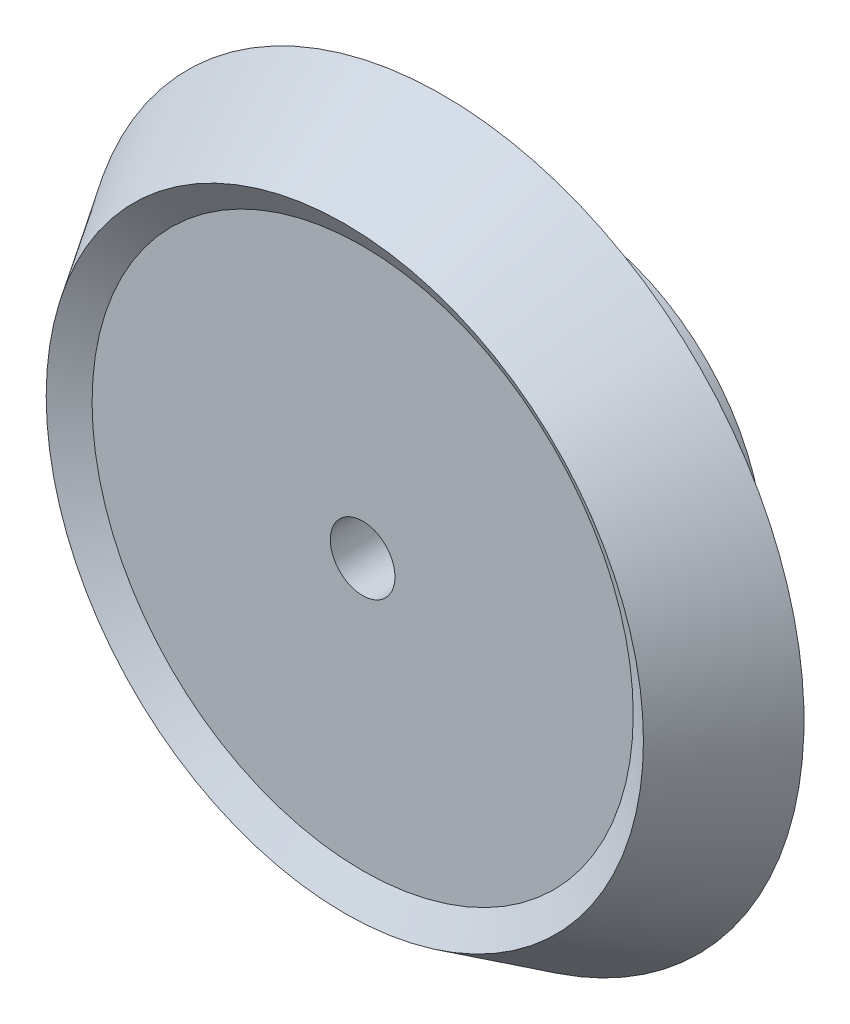
ISO-10303-21;
HEADER;
FILE_DESCRIPTION(('STEP AP214'),'2;1');
FILE_NAME('part.step','',(''),(''),'','','');
FILE_SCHEMA(('AUTOMOTIVE_DESIGN { 1 0 10303 214 1 1 1 1 }'));
ENDSEC;
DATA;
#1=APPLICATION_CONTEXT('core data for automotive mechanical design processes');
#2=APPLICATION_PROTOCOL_DEFINITION('international standard','automotive_design',2000,#1);
#3=PRODUCT_CONTEXT('',#1,'mechanical');
#4=PRODUCT('Part','Part','',(#3));
#5=PRODUCT_RELATED_PRODUCT_CATEGORY('part','',(#4));
#6=PRODUCT_DEFINITION_FORMATION('','',#4);
#7=PRODUCT_DEFINITION_CONTEXT('part definition',#1,'design');
#8=PRODUCT_DEFINITION('design','',#6,#7);
#9=PRODUCT_DEFINITION_SHAPE('','',#8);
#10=(LENGTH_UNIT() NAMED_UNIT(*) SI_UNIT(.MILLI.,.METRE.));
#11=(NAMED_UNIT(*) PLANE_ANGLE_UNIT() SI_UNIT($,.RADIAN.));
#12=(NAMED_UNIT(*) SI_UNIT($,.STERADIAN.) SOLID_ANGLE_UNIT());
#13=UNCERTAINTY_MEASURE_WITH_UNIT(LENGTH_MEASURE(1.E-05),#10,'distance_accuracy_value','');
#14=(GEOMETRIC_REPRESENTATION_CONTEXT(3) GLOBAL_UNCERTAINTY_ASSIGNED_CONTEXT((#13)) GLOBAL_UNIT_ASSIGNED_CONTEXT((#10,
#11,#12)) REPRESENTATION_CONTEXT('',''));
#15=CARTESIAN_POINT('',(0.,0.,0.));
#16=DIRECTION('',(0.,0.,1.));
#17=DIRECTION('',(1.,0.,0.));
#18=AXIS2_PLACEMENT_3D('',#15,#16,#17);
#19=CARTESIAN_POINT('',(0.,0.,-100.244738130201));
#20=DIRECTION('',(0.,0.,-1.));
#21=DIRECTION('',(-1.,0.,0.));
#22=AXIS2_PLACEMENT_3D('',#19,#20,#21);
#23=CYLINDRICAL_SURFACE('',#22,7.24999999999999);
#24=CARTESIAN_POINT('',(0.,0.,-46.));
#25=DIRECTION('',(0.,0.,-1.));
#26=DIRECTION('',(-1.,0.,0.));
#27=AXIS2_PLACEMENT_3D('',#24,#25,#26);
#28=CIRCLE('',#27,7.24999999999999);
#29=CARTESIAN_POINT('',(-7.24999999999999,0.,-46.));
#30=VERTEX_POINT('',#29);
#31=EDGE_CURVE('E10',#30,#30,#28,.T.);
#32=ORIENTED_EDGE('',*,*,#31,.T.);
#33=EDGE_LOOP('',(#32));
#34=FACE_BOUND('',#33,.T.);
#35=CARTESIAN_POINT('',(0.,0.,0.));
#36=DIRECTION('',(0.,0.,-1.));
#37=DIRECTION('',(-1.,0.,0.));
#38=AXIS2_PLACEMENT_3D('',#35,#36,#37);
#39=CIRCLE('',#38,7.24999999999999);
#40=CARTESIAN_POINT('',(-7.24999999999999,0.,0.));
#41=VERTEX_POINT('',#40);
#42=EDGE_CURVE('E82',#41,#41,#39,.T.);
#43=ORIENTED_EDGE('',*,*,#42,.F.);
#44=EDGE_LOOP('',(#43));
#45=FACE_BOUND('',#44,.T.);
#46=ADVANCED_FACE('F43',(#34,#45),#23,.F.);
#47=CARTESIAN_POINT('',(0.,7.24999999999999,-46.));
#48=DIRECTION('',(0.,0.,-1.));
#49=DIRECTION('',(-1.,0.,0.));
#50=AXIS2_PLACEMENT_3D('',#47,#48,#49);
#51=PLANE('',#50);
#52=CARTESIAN_POINT('',(0.,0.,-46.));
#53=DIRECTION('',(0.,0.,-1.));
#54=DIRECTION('',(-1.,0.,0.));
#55=AXIS2_PLACEMENT_3D('',#52,#53,#54);
#56=CIRCLE('',#55,44.);
#57=CARTESIAN_POINT('',(-44.,0.,-46.));
#58=VERTEX_POINT('',#57);
#59=EDGE_CURVE('E50',#58,#58,#56,.T.);
#60=ORIENTED_EDGE('',*,*,#59,.T.);
#61=EDGE_LOOP('',(#60));
#62=FACE_BOUND('',#61,.T.);
#63=ORIENTED_EDGE('',*,*,#31,.F.);
#64=EDGE_LOOP('',(#63));
#65=FACE_BOUND('',#64,.T.);
#66=ADVANCED_FACE('F91',(#62,#65),#51,.T.);
#67=CARTESIAN_POINT('',(0.,0.,-100.244738130201));
#68=DIRECTION('',(0.,0.,-1.));
#69=DIRECTION('',(-1.,0.,0.));
#70=AXIS2_PLACEMENT_3D('',#67,#68,#69);
#71=CYLINDRICAL_SURFACE('',#70,44.);
#72=CARTESIAN_POINT('',(0.,0.,-36.0000000000001));
#73=DIRECTION('',(0.,0.,-1.));
#74=DIRECTION('',(-1.,0.,0.));
#75=AXIS2_PLACEMENT_3D('',#72,#73,#74);
#76=CIRCLE('',#75,44.);
#77=CARTESIAN_POINT('',(-44.,0.,-36.0000000000001));
#78=VERTEX_POINT('',#77);
#79=EDGE_CURVE('E55',#78,#78,#76,.T.);
#80=ORIENTED_EDGE('',*,*,#79,.T.);
#81=EDGE_LOOP('',(#80));
#82=FACE_BOUND('',#81,.T.);
#83=ORIENTED_EDGE('',*,*,#59,.F.);
#84=EDGE_LOOP('',(#83));
#85=FACE_BOUND('',#84,.T.);
#86=ADVANCED_FACE('F95',(#82,#85),#71,.T.);
#87=CARTESIAN_POINT('',(0.,0.,-36.));
#88=DIRECTION('',(0.,0.,-1.));
#89=DIRECTION('',(-1.,0.,0.));
#90=AXIS2_PLACEMENT_3D('',#87,#88,#89);
#91=TOROIDAL_SURFACE('',#90,54.,10.);
#92=CARTESIAN_POINT('',(0.,0.,-26.));
#93=DIRECTION('',(0.,0.,-1.));
#94=DIRECTION('',(-1.,0.,0.));
#95=AXIS2_PLACEMENT_3D('',#92,#93,#94);
#96=CIRCLE('',#95,54.0000000000001);
#97=CARTESIAN_POINT('',(-54.0000000000001,0.,-26.));
#98=VERTEX_POINT('',#97);
#99=EDGE_CURVE('E60',#98,#98,#96,.T.);
#100=ORIENTED_EDGE('',*,*,#99,.T.);
#101=EDGE_LOOP('',(#100));
#102=FACE_BOUND('',#101,.T.);
#103=ORIENTED_EDGE('',*,*,#79,.F.);
#104=EDGE_LOOP('',(#103));
#105=FACE_BOUND('',#104,.T.);
#106=ADVANCED_FACE('F99',(#102,#105),#91,.F.);
#107=CARTESIAN_POINT('',(0.,68.454291567836,-26.));
#108=DIRECTION('',(0.,0.,-1.));
#109=DIRECTION('',(-1.,0.,0.));
#110=AXIS2_PLACEMENT_3D('',#107,#108,#109);
#111=PLANE('',#110);
#112=CARTESIAN_POINT('',(0.,0.,-26.));
#113=DIRECTION('',(0.,0.,-1.));
#114=DIRECTION('',(-1.,0.,0.));
#115=AXIS2_PLACEMENT_3D('',#112,#113,#114);
#116=CIRCLE('',#115,68.454291567836);
#117=CARTESIAN_POINT('',(-68.454291567836,0.,-26.));
#118=VERTEX_POINT('',#117);
#119=EDGE_CURVE('E66',#118,#118,#116,.T.);
#120=ORIENTED_EDGE('',*,*,#119,.T.);
#121=EDGE_LOOP('',(#120));
#122=FACE_BOUND('',#121,.T.);
#123=ORIENTED_EDGE('',*,*,#99,.F.);
#124=EDGE_LOOP('',(#123));
#125=FACE_BOUND('',#124,.T.);
#126=ADVANCED_FACE('F106',(#122,#125),#111,.T.);
#127=CARTESIAN_POINT('',(0.,0.,-26.));
#128=DIRECTION('',(0.,0.,1.));
#129=DIRECTION('',(1.,0.,0.));
#130=AXIS2_PLACEMENT_3D('',#127,#128,#129);
#131=CONICAL_SURFACE('',#130,68.454291567836,1.00459523356814);
#132=CARTESIAN_POINT('',(0.,0.,-18.0256730602629));
#133=DIRECTION('',(0.,0.,-1.));
#134=DIRECTION('',(-1.,0.,0.));
#135=AXIS2_PLACEMENT_3D('',#132,#133,#134);
#136=CIRCLE('',#135,81.);
#137=CARTESIAN_POINT('',(-81.,0.,-18.0256730602629));
#138=VERTEX_POINT('',#137);
#139=EDGE_CURVE('E70',#138,#138,#136,.T.);
#140=ORIENTED_EDGE('',*,*,#139,.T.);
#141=EDGE_LOOP('',(#140));
#142=FACE_BOUND('',#141,.T.);
#143=ORIENTED_EDGE('',*,*,#119,.F.);
#144=EDGE_LOOP('',(#143));
#145=FACE_BOUND('',#144,.T.);
#146=ADVANCED_FACE('F110',(#142,#145),#131,.T.);
#147=CARTESIAN_POINT('',(0.,0.,-18.0256730602629));
#148=DIRECTION('',(0.,0.,-1.));
#149=DIRECTION('',(-1.,0.,0.));
#150=AXIS2_PLACEMENT_3D('',#147,#148,#149);
#151=CONICAL_SURFACE('',#150,81.,0.566201093226753);
#152=CARTESIAN_POINT('',(0.,0.,4.));
#153=DIRECTION('',(0.,0.,-1.));
#154=DIRECTION('',(-1.,0.,0.));
#155=AXIS2_PLACEMENT_3D('',#152,#153,#154);
#156=CIRCLE('',#155,67.);
#157=CARTESIAN_POINT('',(-67.,0.,4.));
#158=VERTEX_POINT('',#157);
#159=EDGE_CURVE('E74',#158,#158,#156,.T.);
#160=ORIENTED_EDGE('',*,*,#159,.T.);
#161=EDGE_LOOP('',(#160));
#162=FACE_BOUND('',#161,.T.);
#163=ORIENTED_EDGE('',*,*,#139,.F.);
#164=EDGE_LOOP('',(#163));
#165=FACE_BOUND('',#164,.T.);
#166=ADVANCED_FACE('F114',(#162,#165),#151,.T.);
#167=CARTESIAN_POINT('',(0.,0.,4.));
#168=DIRECTION('',(0.,0.,1.));
#169=DIRECTION('',(1.,0.,0.));
#170=AXIS2_PLACEMENT_3D('',#167,#168,#169);
#171=CONICAL_SURFACE('',#170,67.,1.00459523356814);
#172=CARTESIAN_POINT('',(0.,0.,0.));
#173=DIRECTION('',(0.,0.,-1.));
#174=DIRECTION('',(-1.,0.,0.));
#175=AXIS2_PLACEMENT_3D('',#172,#173,#174);
#176=CIRCLE('',#175,60.7069505542106);
#177=CARTESIAN_POINT('',(-60.7069505542106,0.,0.));
#178=VERTEX_POINT('',#177);
#179=EDGE_CURVE('E78',#178,#178,#176,.T.);
#180=ORIENTED_EDGE('',*,*,#179,.T.);
#181=EDGE_LOOP('',(#180));
#182=FACE_BOUND('',#181,.T.);
#183=ORIENTED_EDGE('',*,*,#159,.F.);
#184=EDGE_LOOP('',(#183));
#185=FACE_BOUND('',#184,.T.);
#186=ADVANCED_FACE('F118',(#182,#185),#171,.F.);
#187=CARTESIAN_POINT('',(0.,7.24999999999999,0.));
#188=DIRECTION('',(0.,0.,1.));
#189=DIRECTION('',(1.,0.,0.));
#190=AXIS2_PLACEMENT_3D('',#187,#188,#189);
#191=PLANE('',#190);
#192=ORIENTED_EDGE('',*,*,#42,.T.);
#193=EDGE_LOOP('',(#192));
#194=FACE_BOUND('',#193,.T.);
#195=ORIENTED_EDGE('',*,*,#179,.F.);
#196=EDGE_LOOP('',(#195));
#197=FACE_BOUND('',#196,.T.);
#198=ADVANCED_FACE('F87',(#194,#197),#191,.T.);
#199=CLOSED_SHELL('',(#46,#66,#86,#106,#126,#146,#166,#186,#198));
#200=MANIFOLD_SOLID_BREP('B2',#199);
#201=ADVANCED_BREP_SHAPE_REPRESENTATION('',(#18,#200),#14);
#202=SHAPE_DEFINITION_REPRESENTATION(#9,#201);
ENDSEC;
END-ISO-10303-21;
